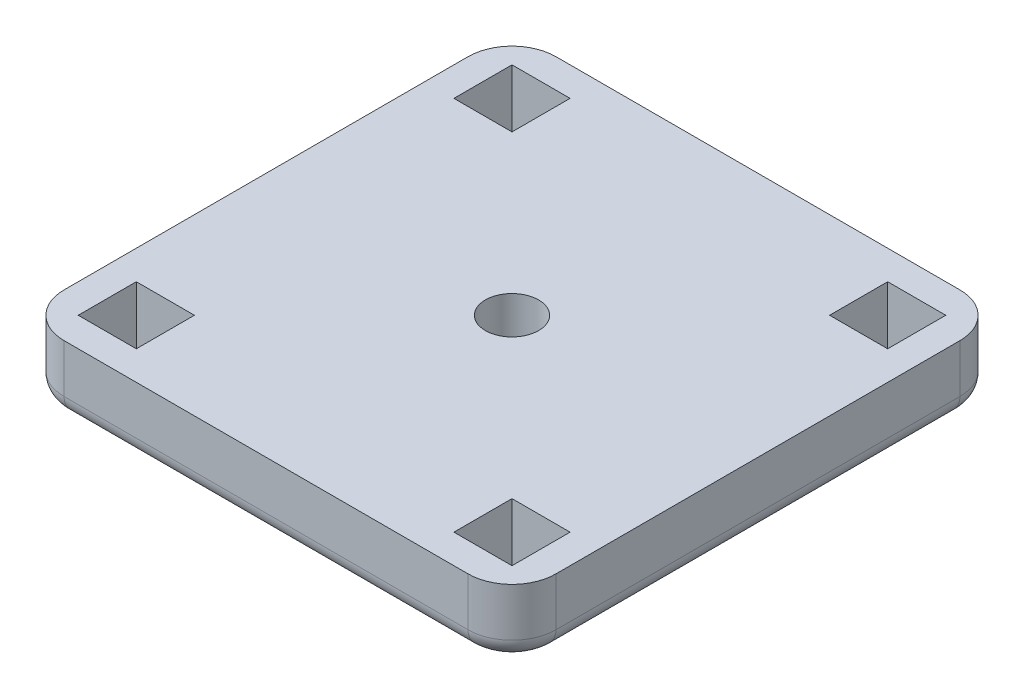
ISO-10303-21;
HEADER;
FILE_DESCRIPTION(('STEP AP214'),'2;1');
FILE_NAME('part.step','',(''),(''),'','','');
FILE_SCHEMA(('AUTOMOTIVE_DESIGN { 1 0 10303 214 1 1 1 1 }'));
ENDSEC;
DATA;
#1=APPLICATION_CONTEXT('core data for automotive mechanical design processes');
#2=APPLICATION_PROTOCOL_DEFINITION('international standard','automotive_design',2000,#1);
#3=PRODUCT_CONTEXT('',#1,'mechanical');
#4=PRODUCT('Part','Part','',(#3));
#5=PRODUCT_RELATED_PRODUCT_CATEGORY('part','',(#4));
#6=PRODUCT_DEFINITION_FORMATION('','',#4);
#7=PRODUCT_DEFINITION_CONTEXT('part definition',#1,'design');
#8=PRODUCT_DEFINITION('design','',#6,#7);
#9=PRODUCT_DEFINITION_SHAPE('','',#8);
#10=(LENGTH_UNIT() NAMED_UNIT(*) SI_UNIT(.MILLI.,.METRE.));
#11=(NAMED_UNIT(*) PLANE_ANGLE_UNIT() SI_UNIT($,.RADIAN.));
#12=(NAMED_UNIT(*) SI_UNIT($,.STERADIAN.) SOLID_ANGLE_UNIT());
#13=UNCERTAINTY_MEASURE_WITH_UNIT(LENGTH_MEASURE(1.E-05),#10,'distance_accuracy_value','');
#14=(GEOMETRIC_REPRESENTATION_CONTEXT(3) GLOBAL_UNCERTAINTY_ASSIGNED_CONTEXT((#13)) GLOBAL_UNIT_ASSIGNED_CONTEXT((#10,
#11,#12)) REPRESENTATION_CONTEXT('',''));
#15=CARTESIAN_POINT('',(0.,0.,0.));
#16=DIRECTION('',(0.,0.,1.));
#17=DIRECTION('',(1.,0.,0.));
#18=AXIS2_PLACEMENT_3D('',#15,#16,#17);
#19=CARTESIAN_POINT('',(0.,0.,0.));
#20=DIRECTION('',(0.,1.,0.));
#21=DIRECTION('',(0.,0.,1.));
#22=AXIS2_PLACEMENT_3D('',#19,#20,#21);
#23=PLANE('',#22);
#24=DIRECTION('',(-1.,0.,0.));
#25=VECTOR('',#24,1.);
#26=CARTESIAN_POINT('',(-16.4,0.,16.4));
#27=LINE('',#26,#25);
#28=CARTESIAN_POINT('',(-16.4,0.,16.4));
#29=VERTEX_POINT('',#28);
#30=CARTESIAN_POINT('',(-22.4,0.,16.4));
#31=VERTEX_POINT('',#30);
#32=EDGE_CURVE('E242',#29,#31,#27,.T.);
#33=ORIENTED_EDGE('',*,*,#32,.T.);
#34=DIRECTION('',(0.,0.,1.));
#35=VECTOR('',#34,1.);
#36=CARTESIAN_POINT('',(-22.4,0.,16.4));
#37=LINE('',#36,#35);
#38=CARTESIAN_POINT('',(-22.4,0.,22.4));
#39=VERTEX_POINT('',#38);
#40=EDGE_CURVE('E280',#31,#39,#37,.T.);
#41=ORIENTED_EDGE('',*,*,#40,.T.);
#42=DIRECTION('',(1.,0.,0.));
#43=VECTOR('',#42,1.);
#44=CARTESIAN_POINT('',(-16.4,0.,22.4));
#45=LINE('',#44,#43);
#46=CARTESIAN_POINT('',(-16.4,0.,22.4));
#47=VERTEX_POINT('',#46);
#48=EDGE_CURVE('E283',#39,#47,#45,.T.);
#49=ORIENTED_EDGE('',*,*,#48,.T.);
#50=DIRECTION('',(0.,0.,-1.));
#51=VECTOR('',#50,1.);
#52=CARTESIAN_POINT('',(-16.4,0.,16.4));
#53=LINE('',#52,#51);
#54=EDGE_CURVE('E270',#47,#29,#53,.T.);
#55=ORIENTED_EDGE('',*,*,#54,.T.);
#56=EDGE_LOOP('',(#33,#41,#49,#55));
#57=FACE_BOUND('',#56,.T.);
#58=DIRECTION('',(0.,0.,1.));
#59=VECTOR('',#58,1.);
#60=CARTESIAN_POINT('',(-22.4,0.,-16.4));
#61=LINE('',#60,#59);
#62=CARTESIAN_POINT('',(-22.4,0.,-22.4));
#63=VERTEX_POINT('',#62);
#64=CARTESIAN_POINT('',(-22.4,0.,-16.4));
#65=VERTEX_POINT('',#64);
#66=EDGE_CURVE('E328',#63,#65,#61,.T.);
#67=ORIENTED_EDGE('',*,*,#66,.T.);
#68=DIRECTION('',(1.,0.,0.));
#69=VECTOR('',#68,1.);
#70=CARTESIAN_POINT('',(-16.4,0.,-16.4));
#71=LINE('',#70,#69);
#72=CARTESIAN_POINT('',(-16.4,0.,-16.4));
#73=VERTEX_POINT('',#72);
#74=EDGE_CURVE('E342',#65,#73,#71,.T.);
#75=ORIENTED_EDGE('',*,*,#74,.T.);
#76=DIRECTION('',(0.,0.,-1.));
#77=VECTOR('',#76,1.);
#78=CARTESIAN_POINT('',(-16.4,0.,-16.4));
#79=LINE('',#78,#77);
#80=CARTESIAN_POINT('',(-16.4,0.,-22.4));
#81=VERTEX_POINT('',#80);
#82=EDGE_CURVE('E345',#73,#81,#79,.T.);
#83=ORIENTED_EDGE('',*,*,#82,.T.);
#84=DIRECTION('',(-1.,0.,0.));
#85=VECTOR('',#84,1.);
#86=CARTESIAN_POINT('',(-16.4,0.,-22.4));
#87=LINE('',#86,#85);
#88=EDGE_CURVE('E332',#81,#63,#87,.T.);
#89=ORIENTED_EDGE('',*,*,#88,.T.);
#90=EDGE_LOOP('',(#67,#75,#83,#89));
#91=FACE_BOUND('',#90,.T.);
#92=CARTESIAN_POINT('',(0.,0.,0.));
#93=DIRECTION('',(0.,1.,0.));
#94=DIRECTION('',(0.,0.,1.));
#95=AXIS2_PLACEMENT_3D('',#92,#93,#94);
#96=CIRCLE('',#95,2.75);
#97=CARTESIAN_POINT('',(0.,0.,2.75));
#98=VERTEX_POINT('',#97);
#99=EDGE_CURVE('E359',#98,#98,#96,.T.);
#100=ORIENTED_EDGE('',*,*,#99,.T.);
#101=EDGE_LOOP('',(#100));
#102=FACE_BOUND('',#101,.T.);
#103=DIRECTION('',(0.,0.,1.));
#104=VECTOR('',#103,1.);
#105=CARTESIAN_POINT('',(16.4,0.,-16.4));
#106=LINE('',#105,#104);
#107=CARTESIAN_POINT('',(16.4,0.,-22.4));
#108=VERTEX_POINT('',#107);
#109=CARTESIAN_POINT('',(16.4,0.,-16.4));
#110=VERTEX_POINT('',#109);
#111=EDGE_CURVE('E297',#108,#110,#106,.T.);
#112=ORIENTED_EDGE('',*,*,#111,.T.);
#113=DIRECTION('',(1.,0.,0.));
#114=VECTOR('',#113,1.);
#115=CARTESIAN_POINT('',(16.4,0.,-16.4));
#116=LINE('',#115,#114);
#117=CARTESIAN_POINT('',(22.4,0.,-16.4));
#118=VERTEX_POINT('',#117);
#119=EDGE_CURVE('E311',#110,#118,#116,.T.);
#120=ORIENTED_EDGE('',*,*,#119,.T.);
#121=DIRECTION('',(0.,0.,-1.));
#122=VECTOR('',#121,1.);
#123=CARTESIAN_POINT('',(22.4,0.,-16.4));
#124=LINE('',#123,#122);
#125=CARTESIAN_POINT('',(22.4,0.,-22.4));
#126=VERTEX_POINT('',#125);
#127=EDGE_CURVE('E314',#118,#126,#124,.T.);
#128=ORIENTED_EDGE('',*,*,#127,.T.);
#129=DIRECTION('',(-1.,0.,0.));
#130=VECTOR('',#129,1.);
#131=CARTESIAN_POINT('',(16.4,0.,-22.4));
#132=LINE('',#131,#130);
#133=EDGE_CURVE('E301',#126,#108,#132,.T.);
#134=ORIENTED_EDGE('',*,*,#133,.T.);
#135=EDGE_LOOP('',(#112,#120,#128,#134));
#136=FACE_BOUND('',#135,.T.);
#137=DIRECTION('',(0.,0.,1.));
#138=VECTOR('',#137,1.);
#139=CARTESIAN_POINT('',(16.4,0.,16.4));
#140=LINE('',#139,#138);
#141=CARTESIAN_POINT('',(16.4,0.,16.4));
#142=VERTEX_POINT('',#141);
#143=CARTESIAN_POINT('',(16.4,0.,22.4));
#144=VERTEX_POINT('',#143);
#145=EDGE_CURVE('E254',#142,#144,#140,.T.);
#146=ORIENTED_EDGE('',*,*,#145,.T.);
#147=DIRECTION('',(1.,0.,0.));
#148=VECTOR('',#147,1.);
#149=CARTESIAN_POINT('',(16.4,0.,22.4));
#150=LINE('',#149,#148);
#151=CARTESIAN_POINT('',(22.4,0.,22.4));
#152=VERTEX_POINT('',#151);
#153=EDGE_CURVE('E241',#144,#152,#150,.T.);
#154=ORIENTED_EDGE('',*,*,#153,.T.);
#155=DIRECTION('',(0.,0.,-1.));
#156=VECTOR('',#155,1.);
#157=CARTESIAN_POINT('',(22.4,0.,16.4));
#158=LINE('',#157,#156);
#159=CARTESIAN_POINT('',(22.4,0.,16.4));
#160=VERTEX_POINT('',#159);
#161=EDGE_CURVE('E258',#152,#160,#158,.T.);
#162=ORIENTED_EDGE('',*,*,#161,.T.);
#163=DIRECTION('',(-1.,0.,0.));
#164=VECTOR('',#163,1.);
#165=CARTESIAN_POINT('',(16.4,0.,16.4));
#166=LINE('',#165,#164);
#167=EDGE_CURVE('E235',#160,#142,#166,.T.);
#168=ORIENTED_EDGE('',*,*,#167,.T.);
#169=EDGE_LOOP('',(#146,#154,#162,#168));
#170=FACE_BOUND('',#169,.T.);
#171=CARTESIAN_POINT('',(20.86,0.,-20.86));
#172=DIRECTION('',(0.,1.,0.));
#173=DIRECTION('',(0.,0.,1.));
#174=AXIS2_PLACEMENT_3D('',#171,#172,#173);
#175=CIRCLE('',#174,2.54);
#176=CARTESIAN_POINT('',(23.4,0.,-20.86));
#177=VERTEX_POINT('',#176);
#178=CARTESIAN_POINT('',(20.86,0.,-23.4));
#179=VERTEX_POINT('',#178);
#180=EDGE_CURVE('E405',#177,#179,#175,.T.);
#181=ORIENTED_EDGE('',*,*,#180,.F.);
#182=DIRECTION('',(0.,0.,-1.));
#183=VECTOR('',#182,1.);
#184=CARTESIAN_POINT('',(23.4,0.,0.));
#185=LINE('',#184,#183);
#186=CARTESIAN_POINT('',(23.4,0.,20.86));
#187=VERTEX_POINT('',#186);
#188=EDGE_CURVE('E378',#177,#187,#185,.F.);
#189=ORIENTED_EDGE('',*,*,#188,.T.);
#190=CARTESIAN_POINT('',(20.86,0.,20.86));
#191=DIRECTION('',(0.,1.,0.));
#192=DIRECTION('',(0.,0.,1.));
#193=AXIS2_PLACEMENT_3D('',#190,#191,#192);
#194=CIRCLE('',#193,2.54);
#195=CARTESIAN_POINT('',(20.86,0.,23.4));
#196=VERTEX_POINT('',#195);
#197=EDGE_CURVE('E403',#196,#187,#194,.T.);
#198=ORIENTED_EDGE('',*,*,#197,.F.);
#199=DIRECTION('',(1.,0.,0.));
#200=VECTOR('',#199,1.);
#201=CARTESIAN_POINT('',(0.,0.,23.4));
#202=LINE('',#201,#200);
#203=CARTESIAN_POINT('',(-20.86,0.,23.4));
#204=VERTEX_POINT('',#203);
#205=EDGE_CURVE('E381',#196,#204,#202,.F.);
#206=ORIENTED_EDGE('',*,*,#205,.T.);
#207=CARTESIAN_POINT('',(-20.86,0.,20.86));
#208=DIRECTION('',(0.,1.,0.));
#209=DIRECTION('',(0.,0.,1.));
#210=AXIS2_PLACEMENT_3D('',#207,#208,#209);
#211=CIRCLE('',#210,2.54);
#212=CARTESIAN_POINT('',(-23.4,0.,20.86));
#213=VERTEX_POINT('',#212);
#214=EDGE_CURVE('E398',#213,#204,#211,.T.);
#215=ORIENTED_EDGE('',*,*,#214,.F.);
#216=DIRECTION('',(0.,0.,1.));
#217=VECTOR('',#216,1.);
#218=CARTESIAN_POINT('',(-23.4,0.,0.));
#219=LINE('',#218,#217);
#220=CARTESIAN_POINT('',(-23.4,0.,-20.86));
#221=VERTEX_POINT('',#220);
#222=EDGE_CURVE('E387',#213,#221,#219,.F.);
#223=ORIENTED_EDGE('',*,*,#222,.T.);
#224=CARTESIAN_POINT('',(-20.86,0.,-20.86));
#225=DIRECTION('',(0.,1.,0.));
#226=DIRECTION('',(0.,0.,1.));
#227=AXIS2_PLACEMENT_3D('',#224,#225,#226);
#228=CIRCLE('',#227,2.54);
#229=CARTESIAN_POINT('',(-20.86,0.,-23.4));
#230=VERTEX_POINT('',#229);
#231=EDGE_CURVE('E400',#230,#221,#228,.T.);
#232=ORIENTED_EDGE('',*,*,#231,.F.);
#233=DIRECTION('',(-1.,0.,0.));
#234=VECTOR('',#233,1.);
#235=CARTESIAN_POINT('',(0.,0.,-23.4));
#236=LINE('',#235,#234);
#237=EDGE_CURVE('E384',#230,#179,#236,.F.);
#238=ORIENTED_EDGE('',*,*,#237,.T.);
#239=EDGE_LOOP('',(#181,#189,#198,#206,#215,#223,#232,#238));
#240=FACE_BOUND('',#239,.T.);
#241=ADVANCED_FACE('F35',(#57,#91,#102,#136,#170,#240),#23,.F.);
#242=CARTESIAN_POINT('',(0.,7.,0.));
#243=DIRECTION('',(0.,1.,0.));
#244=DIRECTION('',(0.,0.,1.));
#245=AXIS2_PLACEMENT_3D('',#242,#243,#244);
#246=PLANE('',#245);
#247=DIRECTION('',(0.,0.,1.));
#248=VECTOR('',#247,1.);
#249=CARTESIAN_POINT('',(-25.4,7.,-25.4));
#250=LINE('',#249,#248);
#251=CARTESIAN_POINT('',(-25.4,7.,-20.86));
#252=VERTEX_POINT('',#251);
#253=CARTESIAN_POINT('',(-25.4,7.,20.86));
#254=VERTEX_POINT('',#253);
#255=EDGE_CURVE('E369',#252,#254,#250,.T.);
#256=ORIENTED_EDGE('',*,*,#255,.T.);
#257=CARTESIAN_POINT('',(-20.86,7.,20.86));
#258=DIRECTION('',(0.,1.,0.));
#259=DIRECTION('',(0.,0.,1.));
#260=AXIS2_PLACEMENT_3D('',#257,#258,#259);
#261=CIRCLE('',#260,4.54);
#262=CARTESIAN_POINT('',(-20.86,7.,25.4));
#263=VERTEX_POINT('',#262);
#264=EDGE_CURVE('E439',#254,#263,#261,.T.);
#265=ORIENTED_EDGE('',*,*,#264,.T.);
#266=DIRECTION('',(1.,0.,0.));
#267=VECTOR('',#266,1.);
#268=CARTESIAN_POINT('',(-25.4,7.,25.4));
#269=LINE('',#268,#267);
#270=CARTESIAN_POINT('',(20.86,7.,25.4));
#271=VERTEX_POINT('',#270);
#272=EDGE_CURVE('E372',#263,#271,#269,.T.);
#273=ORIENTED_EDGE('',*,*,#272,.T.);
#274=CARTESIAN_POINT('',(20.86,7.,20.86));
#275=DIRECTION('',(0.,1.,0.));
#276=DIRECTION('',(0.,0.,1.));
#277=AXIS2_PLACEMENT_3D('',#274,#275,#276);
#278=CIRCLE('',#277,4.54);
#279=CARTESIAN_POINT('',(25.4,7.,20.86));
#280=VERTEX_POINT('',#279);
#281=EDGE_CURVE('E435',#271,#280,#278,.T.);
#282=ORIENTED_EDGE('',*,*,#281,.T.);
#283=DIRECTION('',(0.,0.,-1.));
#284=VECTOR('',#283,1.);
#285=CARTESIAN_POINT('',(25.4,7.,-25.4));
#286=LINE('',#285,#284);
#287=CARTESIAN_POINT('',(25.4,7.,-20.86));
#288=VERTEX_POINT('',#287);
#289=EDGE_CURVE('E363',#280,#288,#286,.T.);
#290=ORIENTED_EDGE('',*,*,#289,.T.);
#291=CARTESIAN_POINT('',(20.86,7.,-20.86));
#292=DIRECTION('',(0.,1.,0.));
#293=DIRECTION('',(0.,0.,1.));
#294=AXIS2_PLACEMENT_3D('',#291,#292,#293);
#295=CIRCLE('',#294,4.54);
#296=CARTESIAN_POINT('',(20.86,7.,-25.4));
#297=VERTEX_POINT('',#296);
#298=EDGE_CURVE('E59',#288,#297,#295,.T.);
#299=ORIENTED_EDGE('',*,*,#298,.T.);
#300=DIRECTION('',(-1.,0.,0.));
#301=VECTOR('',#300,1.);
#302=CARTESIAN_POINT('',(-25.4,7.,-25.4));
#303=LINE('',#302,#301);
#304=CARTESIAN_POINT('',(-20.86,7.,-25.4));
#305=VERTEX_POINT('',#304);
#306=EDGE_CURVE('E367',#297,#305,#303,.T.);
#307=ORIENTED_EDGE('',*,*,#306,.T.);
#308=CARTESIAN_POINT('',(-20.86,7.,-20.86));
#309=DIRECTION('',(0.,1.,0.));
#310=DIRECTION('',(0.,0.,1.));
#311=AXIS2_PLACEMENT_3D('',#308,#309,#310);
#312=CIRCLE('',#311,4.54);
#313=EDGE_CURVE('E437',#305,#252,#312,.T.);
#314=ORIENTED_EDGE('',*,*,#313,.T.);
#315=EDGE_LOOP('',(#256,#265,#273,#282,#290,#299,#307,#314));
#316=FACE_BOUND('',#315,.T.);
#317=CARTESIAN_POINT('',(0.,7.,0.));
#318=DIRECTION('',(0.,1.,0.));
#319=DIRECTION('',(0.,0.,1.));
#320=AXIS2_PLACEMENT_3D('',#317,#318,#319);
#321=CIRCLE('',#320,2.75);
#322=CARTESIAN_POINT('',(0.,7.,2.75));
#323=VERTEX_POINT('',#322);
#324=EDGE_CURVE('E360',#323,#323,#321,.T.);
#325=ORIENTED_EDGE('',*,*,#324,.F.);
#326=EDGE_LOOP('',(#325));
#327=FACE_BOUND('',#326,.T.);
#328=DIRECTION('',(1.,0.,0.));
#329=VECTOR('',#328,1.);
#330=CARTESIAN_POINT('',(-16.4,7.,-16.4));
#331=LINE('',#330,#329);
#332=CARTESIAN_POINT('',(-22.4,7.,-16.4));
#333=VERTEX_POINT('',#332);
#334=CARTESIAN_POINT('',(-16.4,7.,-16.4));
#335=VERTEX_POINT('',#334);
#336=EDGE_CURVE('E331',#333,#335,#331,.T.);
#337=ORIENTED_EDGE('',*,*,#336,.F.);
#338=DIRECTION('',(0.,0.,1.));
#339=VECTOR('',#338,1.);
#340=CARTESIAN_POINT('',(-22.4,7.,-16.4));
#341=LINE('',#340,#339);
#342=CARTESIAN_POINT('',(-22.4,7.,-22.4));
#343=VERTEX_POINT('',#342);
#344=EDGE_CURVE('E329',#343,#333,#341,.T.);
#345=ORIENTED_EDGE('',*,*,#344,.F.);
#346=DIRECTION('',(-1.,0.,0.));
#347=VECTOR('',#346,1.);
#348=CARTESIAN_POINT('',(-16.4,7.,-22.4));
#349=LINE('',#348,#347);
#350=CARTESIAN_POINT('',(-16.4,7.,-22.4));
#351=VERTEX_POINT('',#350);
#352=EDGE_CURVE('E337',#351,#343,#349,.T.);
#353=ORIENTED_EDGE('',*,*,#352,.F.);
#354=DIRECTION('',(0.,0.,-1.));
#355=VECTOR('',#354,1.);
#356=CARTESIAN_POINT('',(-16.4,7.,-16.4));
#357=LINE('',#356,#355);
#358=EDGE_CURVE('E334',#335,#351,#357,.T.);
#359=ORIENTED_EDGE('',*,*,#358,.F.);
#360=EDGE_LOOP('',(#337,#345,#353,#359));
#361=FACE_BOUND('',#360,.T.);
#362=DIRECTION('',(1.,0.,0.));
#363=VECTOR('',#362,1.);
#364=CARTESIAN_POINT('',(16.4,7.,-16.4));
#365=LINE('',#364,#363);
#366=CARTESIAN_POINT('',(16.4,7.,-16.4));
#367=VERTEX_POINT('',#366);
#368=CARTESIAN_POINT('',(22.4,7.,-16.4));
#369=VERTEX_POINT('',#368);
#370=EDGE_CURVE('E300',#367,#369,#365,.T.);
#371=ORIENTED_EDGE('',*,*,#370,.F.);
#372=DIRECTION('',(0.,0.,1.));
#373=VECTOR('',#372,1.);
#374=CARTESIAN_POINT('',(16.4,7.,-16.4));
#375=LINE('',#374,#373);
#376=CARTESIAN_POINT('',(16.4,7.,-22.4));
#377=VERTEX_POINT('',#376);
#378=EDGE_CURVE('E298',#377,#367,#375,.T.);
#379=ORIENTED_EDGE('',*,*,#378,.F.);
#380=DIRECTION('',(-1.,0.,0.));
#381=VECTOR('',#380,1.);
#382=CARTESIAN_POINT('',(16.4,7.,-22.4));
#383=LINE('',#382,#381);
#384=CARTESIAN_POINT('',(22.4,7.,-22.4));
#385=VERTEX_POINT('',#384);
#386=EDGE_CURVE('E306',#385,#377,#383,.T.);
#387=ORIENTED_EDGE('',*,*,#386,.F.);
#388=DIRECTION('',(0.,0.,-1.));
#389=VECTOR('',#388,1.);
#390=CARTESIAN_POINT('',(22.4,7.,-16.4));
#391=LINE('',#390,#389);
#392=EDGE_CURVE('E303',#369,#385,#391,.T.);
#393=ORIENTED_EDGE('',*,*,#392,.F.);
#394=EDGE_LOOP('',(#371,#379,#387,#393));
#395=FACE_BOUND('',#394,.T.);
#396=DIRECTION('',(0.,0.,1.));
#397=VECTOR('',#396,1.);
#398=CARTESIAN_POINT('',(-22.4,7.,16.4));
#399=LINE('',#398,#397);
#400=CARTESIAN_POINT('',(-22.4,7.,16.4));
#401=VERTEX_POINT('',#400);
#402=CARTESIAN_POINT('',(-22.4,7.,22.4));
#403=VERTEX_POINT('',#402);
#404=EDGE_CURVE('E269',#401,#403,#399,.T.);
#405=ORIENTED_EDGE('',*,*,#404,.F.);
#406=DIRECTION('',(-1.,0.,0.));
#407=VECTOR('',#406,1.);
#408=CARTESIAN_POINT('',(-16.4,7.,16.4));
#409=LINE('',#408,#407);
#410=CARTESIAN_POINT('',(-16.4,7.,16.4));
#411=VERTEX_POINT('',#410);
#412=EDGE_CURVE('E267',#411,#401,#409,.T.);
#413=ORIENTED_EDGE('',*,*,#412,.F.);
#414=DIRECTION('',(0.,0.,-1.));
#415=VECTOR('',#414,1.);
#416=CARTESIAN_POINT('',(-16.4,7.,16.4));
#417=LINE('',#416,#415);
#418=CARTESIAN_POINT('',(-16.4,7.,22.4));
#419=VERTEX_POINT('',#418);
#420=EDGE_CURVE('E275',#419,#411,#417,.T.);
#421=ORIENTED_EDGE('',*,*,#420,.F.);
#422=DIRECTION('',(1.,0.,0.));
#423=VECTOR('',#422,1.);
#424=CARTESIAN_POINT('',(-16.4,7.,22.4));
#425=LINE('',#424,#423);
#426=EDGE_CURVE('E272',#403,#419,#425,.T.);
#427=ORIENTED_EDGE('',*,*,#426,.F.);
#428=EDGE_LOOP('',(#405,#413,#421,#427));
#429=FACE_BOUND('',#428,.T.);
#430=DIRECTION('',(1.,0.,0.));
#431=VECTOR('',#430,1.);
#432=CARTESIAN_POINT('',(16.4,7.,22.4));
#433=LINE('',#432,#431);
#434=CARTESIAN_POINT('',(16.4,7.,22.4));
#435=VERTEX_POINT('',#434);
#436=CARTESIAN_POINT('',(22.4,7.,22.4));
#437=VERTEX_POINT('',#436);
#438=EDGE_CURVE('E234',#435,#437,#433,.T.);
#439=ORIENTED_EDGE('',*,*,#438,.F.);
#440=DIRECTION('',(0.,0.,1.));
#441=VECTOR('',#440,1.);
#442=CARTESIAN_POINT('',(16.4,7.,16.4));
#443=LINE('',#442,#441);
#444=CARTESIAN_POINT('',(16.4,7.,16.4));
#445=VERTEX_POINT('',#444);
#446=EDGE_CURVE('E224',#445,#435,#443,.T.);
#447=ORIENTED_EDGE('',*,*,#446,.F.);
#448=DIRECTION('',(-1.,0.,0.));
#449=VECTOR('',#448,1.);
#450=CARTESIAN_POINT('',(16.4,7.,16.4));
#451=LINE('',#450,#449);
#452=CARTESIAN_POINT('',(22.4,7.,16.4));
#453=VERTEX_POINT('',#452);
#454=EDGE_CURVE('E250',#453,#445,#451,.T.);
#455=ORIENTED_EDGE('',*,*,#454,.F.);
#456=DIRECTION('',(0.,0.,-1.));
#457=VECTOR('',#456,1.);
#458=CARTESIAN_POINT('',(22.4,7.,16.4));
#459=LINE('',#458,#457);
#460=EDGE_CURVE('E248',#437,#453,#459,.T.);
#461=ORIENTED_EDGE('',*,*,#460,.F.);
#462=EDGE_LOOP('',(#439,#447,#455,#461));
#463=FACE_BOUND('',#462,.T.);
#464=ADVANCED_FACE('F246',(#316,#327,#361,#395,#429,#463),#246,.T.);
#465=CARTESIAN_POINT('',(25.4,7.,-25.4));
#466=DIRECTION('',(-1.,0.,0.));
#467=DIRECTION('',(0.,0.,1.));
#468=AXIS2_PLACEMENT_3D('',#465,#466,#467);
#469=PLANE('',#468);
#470=ORIENTED_EDGE('',*,*,#289,.F.);
#471=DIRECTION('',(0.,-1.,0.));
#472=VECTOR('',#471,1.);
#473=CARTESIAN_POINT('',(25.4,7.,20.86));
#474=LINE('',#473,#472);
#475=CARTESIAN_POINT('',(25.4,2.,20.86));
#476=VERTEX_POINT('',#475);
#477=EDGE_CURVE('E11',#280,#476,#474,.T.);
#478=ORIENTED_EDGE('',*,*,#477,.T.);
#479=DIRECTION('',(0.,0.,-1.));
#480=VECTOR('',#479,1.);
#481=CARTESIAN_POINT('',(25.4,2.,-25.4));
#482=LINE('',#481,#480);
#483=CARTESIAN_POINT('',(25.4,2.,-20.86));
#484=VERTEX_POINT('',#483);
#485=EDGE_CURVE('E395',#476,#484,#482,.T.);
#486=ORIENTED_EDGE('',*,*,#485,.T.);
#487=DIRECTION('',(0.,-1.,0.));
#488=VECTOR('',#487,1.);
#489=CARTESIAN_POINT('',(25.4,7.,-20.86));
#490=LINE('',#489,#488);
#491=EDGE_CURVE('E44',#484,#288,#490,.F.);
#492=ORIENTED_EDGE('',*,*,#491,.T.);
#493=EDGE_LOOP('',(#470,#478,#486,#492));
#494=FACE_BOUND('',#493,.T.);
#495=ADVANCED_FACE('F516',(#494),#469,.F.);
#496=CARTESIAN_POINT('',(-25.4,7.,-25.4));
#497=DIRECTION('',(0.,0.,1.));
#498=DIRECTION('',(1.,0.,0.));
#499=AXIS2_PLACEMENT_3D('',#496,#497,#498);
#500=PLANE('',#499);
#501=DIRECTION('',(-1.,0.,0.));
#502=VECTOR('',#501,1.);
#503=CARTESIAN_POINT('',(-25.4,2.,-25.4));
#504=LINE('',#503,#502);
#505=CARTESIAN_POINT('',(20.86,2.,-25.4));
#506=VERTEX_POINT('',#505);
#507=CARTESIAN_POINT('',(-20.86,2.,-25.4));
#508=VERTEX_POINT('',#507);
#509=EDGE_CURVE('E390',#506,#508,#504,.T.);
#510=ORIENTED_EDGE('',*,*,#509,.T.);
#511=DIRECTION('',(0.,-1.,0.));
#512=VECTOR('',#511,1.);
#513=CARTESIAN_POINT('',(-20.86,7.,-25.4));
#514=LINE('',#513,#512);
#515=EDGE_CURVE('E52',#508,#305,#514,.F.);
#516=ORIENTED_EDGE('',*,*,#515,.T.);
#517=ORIENTED_EDGE('',*,*,#306,.F.);
#518=DIRECTION('',(0.,-1.,0.));
#519=VECTOR('',#518,1.);
#520=CARTESIAN_POINT('',(20.86,7.,-25.4));
#521=LINE('',#520,#519);
#522=EDGE_CURVE('E441',#297,#506,#521,.T.);
#523=ORIENTED_EDGE('',*,*,#522,.T.);
#524=EDGE_LOOP('',(#510,#516,#517,#523));
#525=FACE_BOUND('',#524,.T.);
#526=ADVANCED_FACE('F486',(#525),#500,.F.);
#527=CARTESIAN_POINT('',(-25.4,7.,-25.4));
#528=DIRECTION('',(1.,0.,0.));
#529=DIRECTION('',(0.,0.,-1.));
#530=AXIS2_PLACEMENT_3D('',#527,#528,#529);
#531=PLANE('',#530);
#532=DIRECTION('',(0.,0.,1.));
#533=VECTOR('',#532,1.);
#534=CARTESIAN_POINT('',(-25.4,2.,-25.4));
#535=LINE('',#534,#533);
#536=CARTESIAN_POINT('',(-25.4,2.,-20.86));
#537=VERTEX_POINT('',#536);
#538=CARTESIAN_POINT('',(-25.4,2.,20.86));
#539=VERTEX_POINT('',#538);
#540=EDGE_CURVE('E375',#537,#539,#535,.T.);
#541=ORIENTED_EDGE('',*,*,#540,.T.);
#542=DIRECTION('',(0.,-1.,0.));
#543=VECTOR('',#542,1.);
#544=CARTESIAN_POINT('',(-25.4,7.,20.86));
#545=LINE('',#544,#543);
#546=EDGE_CURVE('E432',#539,#254,#545,.F.);
#547=ORIENTED_EDGE('',*,*,#546,.T.);
#548=ORIENTED_EDGE('',*,*,#255,.F.);
#549=DIRECTION('',(0.,-1.,0.));
#550=VECTOR('',#549,1.);
#551=CARTESIAN_POINT('',(-25.4,7.,-20.86));
#552=LINE('',#551,#550);
#553=EDGE_CURVE('E430',#252,#537,#552,.T.);
#554=ORIENTED_EDGE('',*,*,#553,.T.);
#555=EDGE_LOOP('',(#541,#547,#548,#554));
#556=FACE_BOUND('',#555,.T.);
#557=ADVANCED_FACE('F466',(#556),#531,.F.);
#558=CARTESIAN_POINT('',(-25.4,7.,25.4));
#559=DIRECTION('',(0.,0.,-1.));
#560=DIRECTION('',(-1.,0.,0.));
#561=AXIS2_PLACEMENT_3D('',#558,#559,#560);
#562=PLANE('',#561);
#563=ORIENTED_EDGE('',*,*,#272,.F.);
#564=DIRECTION('',(0.,-1.,0.));
#565=VECTOR('',#564,1.);
#566=CARTESIAN_POINT('',(-20.86,7.,25.4));
#567=LINE('',#566,#565);
#568=CARTESIAN_POINT('',(-20.86,2.,25.4));
#569=VERTEX_POINT('',#568);
#570=EDGE_CURVE('E428',#263,#569,#567,.T.);
#571=ORIENTED_EDGE('',*,*,#570,.T.);
#572=DIRECTION('',(1.,0.,0.));
#573=VECTOR('',#572,1.);
#574=CARTESIAN_POINT('',(-25.4,2.,25.4));
#575=LINE('',#574,#573);
#576=CARTESIAN_POINT('',(20.86,2.,25.4));
#577=VERTEX_POINT('',#576);
#578=EDGE_CURVE('E392',#569,#577,#575,.T.);
#579=ORIENTED_EDGE('',*,*,#578,.T.);
#580=DIRECTION('',(0.,-1.,0.));
#581=VECTOR('',#580,1.);
#582=CARTESIAN_POINT('',(20.86,7.,25.4));
#583=LINE('',#582,#581);
#584=EDGE_CURVE('E426',#577,#271,#583,.F.);
#585=ORIENTED_EDGE('',*,*,#584,.T.);
#586=EDGE_LOOP('',(#563,#571,#579,#585));
#587=FACE_BOUND('',#586,.T.);
#588=ADVANCED_FACE('F509',(#587),#562,.F.);
#589=CARTESIAN_POINT('',(0.,7.,0.));
#590=DIRECTION('',(0.,-1.,0.));
#591=DIRECTION('',(0.,0.,-1.));
#592=AXIS2_PLACEMENT_3D('',#589,#590,#591);
#593=CYLINDRICAL_SURFACE('',#592,2.75);
#594=ORIENTED_EDGE('',*,*,#324,.T.);
#595=EDGE_LOOP('',(#594));
#596=FACE_BOUND('',#595,.T.);
#597=ORIENTED_EDGE('',*,*,#99,.F.);
#598=EDGE_LOOP('',(#597));
#599=FACE_BOUND('',#598,.T.);
#600=ADVANCED_FACE('F536',(#596,#599),#593,.F.);
#601=CARTESIAN_POINT('',(-22.4,7.,-16.4));
#602=DIRECTION('',(1.,0.,0.));
#603=DIRECTION('',(0.,0.,-1.));
#604=AXIS2_PLACEMENT_3D('',#601,#602,#603);
#605=PLANE('',#604);
#606=ORIENTED_EDGE('',*,*,#66,.F.);
#607=DIRECTION('',(0.,-1.,0.));
#608=VECTOR('',#607,1.);
#609=CARTESIAN_POINT('',(-22.4,7.,-22.4));
#610=LINE('',#609,#608);
#611=EDGE_CURVE('E339',#343,#63,#610,.T.);
#612=ORIENTED_EDGE('',*,*,#611,.F.);
#613=ORIENTED_EDGE('',*,*,#344,.T.);
#614=DIRECTION('',(0.,-1.,0.));
#615=VECTOR('',#614,1.);
#616=CARTESIAN_POINT('',(-22.4,7.,-16.4));
#617=LINE('',#616,#615);
#618=EDGE_CURVE('E356',#333,#65,#617,.T.);
#619=ORIENTED_EDGE('',*,*,#618,.T.);
#620=EDGE_LOOP('',(#606,#612,#613,#619));
#621=FACE_BOUND('',#620,.T.);
#622=ADVANCED_FACE('F553',(#621),#605,.T.);
#623=CARTESIAN_POINT('',(-16.4,7.,-16.4));
#624=DIRECTION('',(0.,0.,-1.));
#625=DIRECTION('',(-1.,0.,0.));
#626=AXIS2_PLACEMENT_3D('',#623,#624,#625);
#627=PLANE('',#626);
#628=ORIENTED_EDGE('',*,*,#74,.F.);
#629=ORIENTED_EDGE('',*,*,#618,.F.);
#630=ORIENTED_EDGE('',*,*,#336,.T.);
#631=DIRECTION('',(0.,-1.,0.));
#632=VECTOR('',#631,1.);
#633=CARTESIAN_POINT('',(-16.4,7.,-16.4));
#634=LINE('',#633,#632);
#635=EDGE_CURVE('E354',#335,#73,#634,.T.);
#636=ORIENTED_EDGE('',*,*,#635,.T.);
#637=EDGE_LOOP('',(#628,#629,#630,#636));
#638=FACE_BOUND('',#637,.T.);
#639=ADVANCED_FACE('F560',(#638),#627,.T.);
#640=CARTESIAN_POINT('',(-16.4,7.,-16.4));
#641=DIRECTION('',(-1.,0.,0.));
#642=DIRECTION('',(0.,0.,1.));
#643=AXIS2_PLACEMENT_3D('',#640,#641,#642);
#644=PLANE('',#643);
#645=ORIENTED_EDGE('',*,*,#82,.F.);
#646=ORIENTED_EDGE('',*,*,#635,.F.);
#647=ORIENTED_EDGE('',*,*,#358,.T.);
#648=DIRECTION('',(0.,-1.,0.));
#649=VECTOR('',#648,1.);
#650=CARTESIAN_POINT('',(-16.4,7.,-22.4));
#651=LINE('',#650,#649);
#652=EDGE_CURVE('E352',#351,#81,#651,.T.);
#653=ORIENTED_EDGE('',*,*,#652,.T.);
#654=EDGE_LOOP('',(#645,#646,#647,#653));
#655=FACE_BOUND('',#654,.T.);
#656=ADVANCED_FACE('F568',(#655),#644,.T.);
#657=CARTESIAN_POINT('',(-16.4,7.,-22.4));
#658=DIRECTION('',(0.,0.,1.));
#659=DIRECTION('',(1.,0.,0.));
#660=AXIS2_PLACEMENT_3D('',#657,#658,#659);
#661=PLANE('',#660);
#662=ORIENTED_EDGE('',*,*,#88,.F.);
#663=ORIENTED_EDGE('',*,*,#652,.F.);
#664=ORIENTED_EDGE('',*,*,#352,.T.);
#665=ORIENTED_EDGE('',*,*,#611,.T.);
#666=EDGE_LOOP('',(#662,#663,#664,#665));
#667=FACE_BOUND('',#666,.T.);
#668=ADVANCED_FACE('F576',(#667),#661,.T.);
#669=CARTESIAN_POINT('',(16.4,7.,-16.4));
#670=DIRECTION('',(1.,0.,0.));
#671=DIRECTION('',(0.,0.,-1.));
#672=AXIS2_PLACEMENT_3D('',#669,#670,#671);
#673=PLANE('',#672);
#674=ORIENTED_EDGE('',*,*,#111,.F.);
#675=DIRECTION('',(0.,-1.,0.));
#676=VECTOR('',#675,1.);
#677=CARTESIAN_POINT('',(16.4,7.,-22.4));
#678=LINE('',#677,#676);
#679=EDGE_CURVE('E308',#377,#108,#678,.T.);
#680=ORIENTED_EDGE('',*,*,#679,.F.);
#681=ORIENTED_EDGE('',*,*,#378,.T.);
#682=DIRECTION('',(0.,-1.,0.));
#683=VECTOR('',#682,1.);
#684=CARTESIAN_POINT('',(16.4,7.,-16.4));
#685=LINE('',#684,#683);
#686=EDGE_CURVE('E325',#367,#110,#685,.T.);
#687=ORIENTED_EDGE('',*,*,#686,.T.);
#688=EDGE_LOOP('',(#674,#680,#681,#687));
#689=FACE_BOUND('',#688,.T.);
#690=ADVANCED_FACE('F584',(#689),#673,.T.);
#691=CARTESIAN_POINT('',(16.4,7.,-16.4));
#692=DIRECTION('',(0.,0.,-1.));
#693=DIRECTION('',(-1.,0.,0.));
#694=AXIS2_PLACEMENT_3D('',#691,#692,#693);
#695=PLANE('',#694);
#696=ORIENTED_EDGE('',*,*,#119,.F.);
#697=ORIENTED_EDGE('',*,*,#686,.F.);
#698=ORIENTED_EDGE('',*,*,#370,.T.);
#699=DIRECTION('',(0.,-1.,0.));
#700=VECTOR('',#699,1.);
#701=CARTESIAN_POINT('',(22.4,7.,-16.4));
#702=LINE('',#701,#700);
#703=EDGE_CURVE('E323',#369,#118,#702,.T.);
#704=ORIENTED_EDGE('',*,*,#703,.T.);
#705=EDGE_LOOP('',(#696,#697,#698,#704));
#706=FACE_BOUND('',#705,.T.);
#707=ADVANCED_FACE('F592',(#706),#695,.T.);
#708=CARTESIAN_POINT('',(22.4,7.,-16.4));
#709=DIRECTION('',(-1.,0.,0.));
#710=DIRECTION('',(0.,0.,1.));
#711=AXIS2_PLACEMENT_3D('',#708,#709,#710);
#712=PLANE('',#711);
#713=ORIENTED_EDGE('',*,*,#127,.F.);
#714=ORIENTED_EDGE('',*,*,#703,.F.);
#715=ORIENTED_EDGE('',*,*,#392,.T.);
#716=DIRECTION('',(0.,-1.,0.));
#717=VECTOR('',#716,1.);
#718=CARTESIAN_POINT('',(22.4,7.,-22.4));
#719=LINE('',#718,#717);
#720=EDGE_CURVE('E321',#385,#126,#719,.T.);
#721=ORIENTED_EDGE('',*,*,#720,.T.);
#722=EDGE_LOOP('',(#713,#714,#715,#721));
#723=FACE_BOUND('',#722,.T.);
#724=ADVANCED_FACE('F600',(#723),#712,.T.);
#725=CARTESIAN_POINT('',(16.4,7.,-22.4));
#726=DIRECTION('',(0.,0.,1.));
#727=DIRECTION('',(1.,0.,0.));
#728=AXIS2_PLACEMENT_3D('',#725,#726,#727);
#729=PLANE('',#728);
#730=ORIENTED_EDGE('',*,*,#133,.F.);
#731=ORIENTED_EDGE('',*,*,#720,.F.);
#732=ORIENTED_EDGE('',*,*,#386,.T.);
#733=ORIENTED_EDGE('',*,*,#679,.T.);
#734=EDGE_LOOP('',(#730,#731,#732,#733));
#735=FACE_BOUND('',#734,.T.);
#736=ADVANCED_FACE('F608',(#735),#729,.T.);
#737=CARTESIAN_POINT('',(-16.4,7.,16.4));
#738=DIRECTION('',(0.,0.,1.));
#739=DIRECTION('',(1.,0.,0.));
#740=AXIS2_PLACEMENT_3D('',#737,#738,#739);
#741=PLANE('',#740);
#742=ORIENTED_EDGE('',*,*,#32,.F.);
#743=DIRECTION('',(0.,-1.,0.));
#744=VECTOR('',#743,1.);
#745=CARTESIAN_POINT('',(-16.4,7.,16.4));
#746=LINE('',#745,#744);
#747=EDGE_CURVE('E277',#411,#29,#746,.T.);
#748=ORIENTED_EDGE('',*,*,#747,.F.);
#749=ORIENTED_EDGE('',*,*,#412,.T.);
#750=DIRECTION('',(0.,-1.,0.));
#751=VECTOR('',#750,1.);
#752=CARTESIAN_POINT('',(-22.4,7.,16.4));
#753=LINE('',#752,#751);
#754=EDGE_CURVE('E294',#401,#31,#753,.T.);
#755=ORIENTED_EDGE('',*,*,#754,.T.);
#756=EDGE_LOOP('',(#742,#748,#749,#755));
#757=FACE_BOUND('',#756,.T.);
#758=ADVANCED_FACE('F616',(#757),#741,.T.);
#759=CARTESIAN_POINT('',(-22.4,7.,16.4));
#760=DIRECTION('',(1.,0.,0.));
#761=DIRECTION('',(0.,0.,-1.));
#762=AXIS2_PLACEMENT_3D('',#759,#760,#761);
#763=PLANE('',#762);
#764=ORIENTED_EDGE('',*,*,#40,.F.);
#765=ORIENTED_EDGE('',*,*,#754,.F.);
#766=ORIENTED_EDGE('',*,*,#404,.T.);
#767=DIRECTION('',(0.,-1.,0.));
#768=VECTOR('',#767,1.);
#769=CARTESIAN_POINT('',(-22.4,7.,22.4));
#770=LINE('',#769,#768);
#771=EDGE_CURVE('E292',#403,#39,#770,.T.);
#772=ORIENTED_EDGE('',*,*,#771,.T.);
#773=EDGE_LOOP('',(#764,#765,#766,#772));
#774=FACE_BOUND('',#773,.T.);
#775=ADVANCED_FACE('F624',(#774),#763,.T.);
#776=CARTESIAN_POINT('',(-16.4,7.,22.4));
#777=DIRECTION('',(0.,0.,-1.));
#778=DIRECTION('',(-1.,0.,0.));
#779=AXIS2_PLACEMENT_3D('',#776,#777,#778);
#780=PLANE('',#779);
#781=ORIENTED_EDGE('',*,*,#48,.F.);
#782=ORIENTED_EDGE('',*,*,#771,.F.);
#783=ORIENTED_EDGE('',*,*,#426,.T.);
#784=DIRECTION('',(0.,-1.,0.));
#785=VECTOR('',#784,1.);
#786=CARTESIAN_POINT('',(-16.4,7.,22.4));
#787=LINE('',#786,#785);
#788=EDGE_CURVE('E290',#419,#47,#787,.T.);
#789=ORIENTED_EDGE('',*,*,#788,.T.);
#790=EDGE_LOOP('',(#781,#782,#783,#789));
#791=FACE_BOUND('',#790,.T.);
#792=ADVANCED_FACE('F632',(#791),#780,.T.);
#793=CARTESIAN_POINT('',(-16.4,7.,16.4));
#794=DIRECTION('',(-1.,0.,0.));
#795=DIRECTION('',(0.,0.,1.));
#796=AXIS2_PLACEMENT_3D('',#793,#794,#795);
#797=PLANE('',#796);
#798=ORIENTED_EDGE('',*,*,#54,.F.);
#799=ORIENTED_EDGE('',*,*,#788,.F.);
#800=ORIENTED_EDGE('',*,*,#420,.T.);
#801=ORIENTED_EDGE('',*,*,#747,.T.);
#802=EDGE_LOOP('',(#798,#799,#800,#801));
#803=FACE_BOUND('',#802,.T.);
#804=ADVANCED_FACE('F640',(#803),#797,.T.);
#805=CARTESIAN_POINT('',(16.4,7.,16.4));
#806=DIRECTION('',(1.,0.,0.));
#807=DIRECTION('',(0.,0.,-1.));
#808=AXIS2_PLACEMENT_3D('',#805,#806,#807);
#809=PLANE('',#808);
#810=ORIENTED_EDGE('',*,*,#145,.F.);
#811=DIRECTION('',(0.,-1.,0.));
#812=VECTOR('',#811,1.);
#813=CARTESIAN_POINT('',(16.4,7.,16.4));
#814=LINE('',#813,#812);
#815=EDGE_CURVE('E230',#445,#142,#814,.T.);
#816=ORIENTED_EDGE('',*,*,#815,.F.);
#817=ORIENTED_EDGE('',*,*,#446,.T.);
#818=DIRECTION('',(0.,-1.,0.));
#819=VECTOR('',#818,1.);
#820=CARTESIAN_POINT('',(16.4,7.,22.4));
#821=LINE('',#820,#819);
#822=EDGE_CURVE('E227',#435,#144,#821,.T.);
#823=ORIENTED_EDGE('',*,*,#822,.T.);
#824=EDGE_LOOP('',(#810,#816,#817,#823));
#825=FACE_BOUND('',#824,.T.);
#826=ADVANCED_FACE('F226',(#825),#809,.T.);
#827=CARTESIAN_POINT('',(16.4,7.,22.4));
#828=DIRECTION('',(0.,0.,-1.));
#829=DIRECTION('',(-1.,0.,0.));
#830=AXIS2_PLACEMENT_3D('',#827,#828,#829);
#831=PLANE('',#830);
#832=ORIENTED_EDGE('',*,*,#153,.F.);
#833=ORIENTED_EDGE('',*,*,#822,.F.);
#834=ORIENTED_EDGE('',*,*,#438,.T.);
#835=DIRECTION('',(0.,-1.,0.));
#836=VECTOR('',#835,1.);
#837=CARTESIAN_POINT('',(22.4,7.,22.4));
#838=LINE('',#837,#836);
#839=EDGE_CURVE('E243',#437,#152,#838,.T.);
#840=ORIENTED_EDGE('',*,*,#839,.T.);
#841=EDGE_LOOP('',(#832,#833,#834,#840));
#842=FACE_BOUND('',#841,.T.);
#843=ADVANCED_FACE('F238',(#842),#831,.T.);
#844=CARTESIAN_POINT('',(22.4,7.,16.4));
#845=DIRECTION('',(-1.,0.,0.));
#846=DIRECTION('',(0.,0.,1.));
#847=AXIS2_PLACEMENT_3D('',#844,#845,#846);
#848=PLANE('',#847);
#849=ORIENTED_EDGE('',*,*,#161,.F.);
#850=ORIENTED_EDGE('',*,*,#839,.F.);
#851=ORIENTED_EDGE('',*,*,#460,.T.);
#852=DIRECTION('',(0.,-1.,0.));
#853=VECTOR('',#852,1.);
#854=CARTESIAN_POINT('',(22.4,7.,16.4));
#855=LINE('',#854,#853);
#856=EDGE_CURVE('E264',#453,#160,#855,.T.);
#857=ORIENTED_EDGE('',*,*,#856,.T.);
#858=EDGE_LOOP('',(#849,#850,#851,#857));
#859=FACE_BOUND('',#858,.T.);
#860=ADVANCED_FACE('F661',(#859),#848,.T.);
#861=CARTESIAN_POINT('',(16.4,7.,16.4));
#862=DIRECTION('',(0.,0.,1.));
#863=DIRECTION('',(1.,0.,0.));
#864=AXIS2_PLACEMENT_3D('',#861,#862,#863);
#865=PLANE('',#864);
#866=ORIENTED_EDGE('',*,*,#167,.F.);
#867=ORIENTED_EDGE('',*,*,#856,.F.);
#868=ORIENTED_EDGE('',*,*,#454,.T.);
#869=ORIENTED_EDGE('',*,*,#815,.T.);
#870=EDGE_LOOP('',(#866,#867,#868,#869));
#871=FACE_BOUND('',#870,.T.);
#872=ADVANCED_FACE('F668',(#871),#865,.T.);
#873=CARTESIAN_POINT('',(23.4,2.,-25.4));
#874=DIRECTION('',(0.,0.,-1.));
#875=DIRECTION('',(-1.,0.,0.));
#876=AXIS2_PLACEMENT_3D('',#873,#874,#875);
#877=CYLINDRICAL_SURFACE('',#876,2.);
#878=ORIENTED_EDGE('',*,*,#485,.F.);
#879=CARTESIAN_POINT('',(23.4,2.,20.86));
#880=DIRECTION('',(0.,0.,-1.));
#881=DIRECTION('',(-1.,0.,0.));
#882=AXIS2_PLACEMENT_3D('',#879,#880,#881);
#883=CIRCLE('',#882,2.);
#884=EDGE_CURVE('E414',#476,#187,#883,.T.);
#885=ORIENTED_EDGE('',*,*,#884,.T.);
#886=ORIENTED_EDGE('',*,*,#188,.F.);
#887=CARTESIAN_POINT('',(23.4,2.,-20.86));
#888=DIRECTION('',(0.,0.,1.));
#889=DIRECTION('',(1.,0.,0.));
#890=AXIS2_PLACEMENT_3D('',#887,#888,#889);
#891=CIRCLE('',#890,2.);
#892=EDGE_CURVE('E412',#177,#484,#891,.T.);
#893=ORIENTED_EDGE('',*,*,#892,.T.);
#894=EDGE_LOOP('',(#878,#885,#886,#893));
#895=FACE_BOUND('',#894,.T.);
#896=ADVANCED_FACE('F497',(#895),#877,.T.);
#897=CARTESIAN_POINT('',(-25.4,2.,-23.4));
#898=DIRECTION('',(-1.,0.,0.));
#899=DIRECTION('',(0.,0.,1.));
#900=AXIS2_PLACEMENT_3D('',#897,#898,#899);
#901=CYLINDRICAL_SURFACE('',#900,2.);
#902=ORIENTED_EDGE('',*,*,#509,.F.);
#903=CARTESIAN_POINT('',(20.86,2.,-23.4));
#904=DIRECTION('',(-1.,0.,0.));
#905=DIRECTION('',(0.,0.,1.));
#906=AXIS2_PLACEMENT_3D('',#903,#904,#905);
#907=CIRCLE('',#906,2.);
#908=EDGE_CURVE('E410',#506,#179,#907,.T.);
#909=ORIENTED_EDGE('',*,*,#908,.T.);
#910=ORIENTED_EDGE('',*,*,#237,.F.);
#911=CARTESIAN_POINT('',(-20.86,2.,-23.4));
#912=DIRECTION('',(1.,0.,0.));
#913=DIRECTION('',(0.,0.,-1.));
#914=AXIS2_PLACEMENT_3D('',#911,#912,#913);
#915=CIRCLE('',#914,2.);
#916=EDGE_CURVE('E408',#230,#508,#915,.T.);
#917=ORIENTED_EDGE('',*,*,#916,.T.);
#918=EDGE_LOOP('',(#902,#909,#910,#917));
#919=FACE_BOUND('',#918,.T.);
#920=ADVANCED_FACE('F484',(#919),#901,.T.);
#921=CARTESIAN_POINT('',(-25.4,2.,23.4));
#922=DIRECTION('',(1.,0.,0.));
#923=DIRECTION('',(0.,0.,-1.));
#924=AXIS2_PLACEMENT_3D('',#921,#922,#923);
#925=CYLINDRICAL_SURFACE('',#924,2.);
#926=ORIENTED_EDGE('',*,*,#578,.F.);
#927=CARTESIAN_POINT('',(-20.86,2.,23.4));
#928=DIRECTION('',(1.,0.,0.));
#929=DIRECTION('',(0.,0.,-1.));
#930=AXIS2_PLACEMENT_3D('',#927,#928,#929);
#931=CIRCLE('',#930,2.);
#932=EDGE_CURVE('E423',#569,#204,#931,.T.);
#933=ORIENTED_EDGE('',*,*,#932,.T.);
#934=ORIENTED_EDGE('',*,*,#205,.F.);
#935=CARTESIAN_POINT('',(20.86,2.,23.4));
#936=DIRECTION('',(-1.,0.,0.));
#937=DIRECTION('',(0.,0.,1.));
#938=AXIS2_PLACEMENT_3D('',#935,#936,#937);
#939=CIRCLE('',#938,2.);
#940=EDGE_CURVE('E421',#196,#577,#939,.T.);
#941=ORIENTED_EDGE('',*,*,#940,.T.);
#942=EDGE_LOOP('',(#926,#933,#934,#941));
#943=FACE_BOUND('',#942,.T.);
#944=ADVANCED_FACE('F506',(#943),#925,.T.);
#945=CARTESIAN_POINT('',(-23.4,2.,-25.4));
#946=DIRECTION('',(0.,0.,1.));
#947=DIRECTION('',(1.,0.,0.));
#948=AXIS2_PLACEMENT_3D('',#945,#946,#947);
#949=CYLINDRICAL_SURFACE('',#948,2.);
#950=ORIENTED_EDGE('',*,*,#540,.F.);
#951=CARTESIAN_POINT('',(-23.4,2.,-20.86));
#952=DIRECTION('',(0.,0.,1.));
#953=DIRECTION('',(1.,0.,0.));
#954=AXIS2_PLACEMENT_3D('',#951,#952,#953);
#955=CIRCLE('',#954,2.);
#956=EDGE_CURVE('E419',#537,#221,#955,.T.);
#957=ORIENTED_EDGE('',*,*,#956,.T.);
#958=ORIENTED_EDGE('',*,*,#222,.F.);
#959=CARTESIAN_POINT('',(-23.4,2.,20.86));
#960=DIRECTION('',(0.,0.,-1.));
#961=DIRECTION('',(-1.,0.,0.));
#962=AXIS2_PLACEMENT_3D('',#959,#960,#961);
#963=CIRCLE('',#962,2.);
#964=EDGE_CURVE('E417',#213,#539,#963,.T.);
#965=ORIENTED_EDGE('',*,*,#964,.T.);
#966=EDGE_LOOP('',(#950,#957,#958,#965));
#967=FACE_BOUND('',#966,.T.);
#968=ADVANCED_FACE('F475',(#967),#949,.T.);
#969=CARTESIAN_POINT('',(20.86,7.,-20.86));
#970=DIRECTION('',(0.,-1.,0.));
#971=DIRECTION('',(0.,0.,-1.));
#972=AXIS2_PLACEMENT_3D('',#969,#970,#971);
#973=CYLINDRICAL_SURFACE('',#972,4.54);
#974=ORIENTED_EDGE('',*,*,#298,.F.);
#975=ORIENTED_EDGE('',*,*,#491,.F.);
#976=CARTESIAN_POINT('',(20.86,2.,-20.86));
#977=DIRECTION('',(0.,1.,0.));
#978=DIRECTION('',(0.,0.,1.));
#979=AXIS2_PLACEMENT_3D('',#976,#977,#978);
#980=CIRCLE('',#979,4.54);
#981=EDGE_CURVE('E256',#506,#484,#980,.F.);
#982=ORIENTED_EDGE('',*,*,#981,.F.);
#983=ORIENTED_EDGE('',*,*,#522,.F.);
#984=EDGE_LOOP('',(#974,#975,#982,#983));
#985=FACE_BOUND('',#984,.T.);
#986=ADVANCED_FACE('F489',(#985),#973,.T.);
#987=CARTESIAN_POINT('',(20.86,2.,-20.86));
#988=DIRECTION('',(0.,1.,0.));
#989=DIRECTION('',(0.,0.,1.));
#990=AXIS2_PLACEMENT_3D('',#987,#988,#989);
#991=TOROIDAL_SURFACE('',#990,2.54,2.);
#992=ORIENTED_EDGE('',*,*,#892,.F.);
#993=ORIENTED_EDGE('',*,*,#180,.T.);
#994=ORIENTED_EDGE('',*,*,#908,.F.);
#995=ORIENTED_EDGE('',*,*,#981,.T.);
#996=EDGE_LOOP('',(#992,#993,#994,#995));
#997=FACE_BOUND('',#996,.T.);
#998=ADVANCED_FACE('F493',(#997),#991,.T.);
#999=CARTESIAN_POINT('',(20.86,7.,20.86));
#1000=DIRECTION('',(0.,-1.,0.));
#1001=DIRECTION('',(0.,0.,-1.));
#1002=AXIS2_PLACEMENT_3D('',#999,#1000,#1001);
#1003=CYLINDRICAL_SURFACE('',#1002,4.54);
#1004=ORIENTED_EDGE('',*,*,#281,.F.);
#1005=ORIENTED_EDGE('',*,*,#584,.F.);
#1006=CARTESIAN_POINT('',(20.86,2.,20.86));
#1007=DIRECTION('',(0.,1.,0.));
#1008=DIRECTION('',(0.,0.,1.));
#1009=AXIS2_PLACEMENT_3D('',#1006,#1007,#1008);
#1010=CIRCLE('',#1009,4.54);
#1011=EDGE_CURVE('E447',#476,#577,#1010,.F.);
#1012=ORIENTED_EDGE('',*,*,#1011,.F.);
#1013=ORIENTED_EDGE('',*,*,#477,.F.);
#1014=EDGE_LOOP('',(#1004,#1005,#1012,#1013));
#1015=FACE_BOUND('',#1014,.T.);
#1016=ADVANCED_FACE('F512',(#1015),#1003,.T.);
#1017=CARTESIAN_POINT('',(20.86,2.,20.86));
#1018=DIRECTION('',(0.,1.,0.));
#1019=DIRECTION('',(0.,0.,1.));
#1020=AXIS2_PLACEMENT_3D('',#1017,#1018,#1019);
#1021=TOROIDAL_SURFACE('',#1020,2.54,2.);
#1022=ORIENTED_EDGE('',*,*,#884,.F.);
#1023=ORIENTED_EDGE('',*,*,#1011,.T.);
#1024=ORIENTED_EDGE('',*,*,#940,.F.);
#1025=ORIENTED_EDGE('',*,*,#197,.T.);
#1026=EDGE_LOOP('',(#1022,#1023,#1024,#1025));
#1027=FACE_BOUND('',#1026,.T.);
#1028=ADVANCED_FACE('F501',(#1027),#1021,.T.);
#1029=CARTESIAN_POINT('',(-20.86,7.,-20.86));
#1030=DIRECTION('',(0.,-1.,0.));
#1031=DIRECTION('',(0.,0.,-1.));
#1032=AXIS2_PLACEMENT_3D('',#1029,#1030,#1031);
#1033=CYLINDRICAL_SURFACE('',#1032,4.54);
#1034=ORIENTED_EDGE('',*,*,#313,.F.);
#1035=ORIENTED_EDGE('',*,*,#515,.F.);
#1036=CARTESIAN_POINT('',(-20.86,2.,-20.86));
#1037=DIRECTION('',(0.,1.,0.));
#1038=DIRECTION('',(0.,0.,1.));
#1039=AXIS2_PLACEMENT_3D('',#1036,#1037,#1038);
#1040=CIRCLE('',#1039,4.54);
#1041=EDGE_CURVE('E449',#537,#508,#1040,.F.);
#1042=ORIENTED_EDGE('',*,*,#1041,.F.);
#1043=ORIENTED_EDGE('',*,*,#553,.F.);
#1044=EDGE_LOOP('',(#1034,#1035,#1042,#1043));
#1045=FACE_BOUND('',#1044,.T.);
#1046=ADVANCED_FACE('F473',(#1045),#1033,.T.);
#1047=CARTESIAN_POINT('',(-20.86,2.,-20.86));
#1048=DIRECTION('',(0.,1.,0.));
#1049=DIRECTION('',(0.,0.,1.));
#1050=AXIS2_PLACEMENT_3D('',#1047,#1048,#1049);
#1051=TOROIDAL_SURFACE('',#1050,2.54,2.);
#1052=ORIENTED_EDGE('',*,*,#916,.F.);
#1053=ORIENTED_EDGE('',*,*,#231,.T.);
#1054=ORIENTED_EDGE('',*,*,#956,.F.);
#1055=ORIENTED_EDGE('',*,*,#1041,.T.);
#1056=EDGE_LOOP('',(#1052,#1053,#1054,#1055));
#1057=FACE_BOUND('',#1056,.T.);
#1058=ADVANCED_FACE('F481',(#1057),#1051,.T.);
#1059=CARTESIAN_POINT('',(-20.86,7.,20.86));
#1060=DIRECTION('',(0.,-1.,0.));
#1061=DIRECTION('',(0.,0.,-1.));
#1062=AXIS2_PLACEMENT_3D('',#1059,#1060,#1061);
#1063=CYLINDRICAL_SURFACE('',#1062,4.54);
#1064=ORIENTED_EDGE('',*,*,#264,.F.);
#1065=ORIENTED_EDGE('',*,*,#546,.F.);
#1066=CARTESIAN_POINT('',(-20.86,2.,20.86));
#1067=DIRECTION('',(0.,1.,0.));
#1068=DIRECTION('',(0.,0.,1.));
#1069=AXIS2_PLACEMENT_3D('',#1066,#1067,#1068);
#1070=CIRCLE('',#1069,4.54);
#1071=EDGE_CURVE('E39',#569,#539,#1070,.F.);
#1072=ORIENTED_EDGE('',*,*,#1071,.F.);
#1073=ORIENTED_EDGE('',*,*,#570,.F.);
#1074=EDGE_LOOP('',(#1064,#1065,#1072,#1073));
#1075=FACE_BOUND('',#1074,.T.);
#1076=ADVANCED_FACE('F37',(#1075),#1063,.T.);
#1077=CARTESIAN_POINT('',(-20.86,2.,20.86));
#1078=DIRECTION('',(0.,1.,0.));
#1079=DIRECTION('',(0.,0.,1.));
#1080=AXIS2_PLACEMENT_3D('',#1077,#1078,#1079);
#1081=TOROIDAL_SURFACE('',#1080,2.54,2.);
#1082=ORIENTED_EDGE('',*,*,#932,.F.);
#1083=ORIENTED_EDGE('',*,*,#1071,.T.);
#1084=ORIENTED_EDGE('',*,*,#964,.F.);
#1085=ORIENTED_EDGE('',*,*,#214,.T.);
#1086=EDGE_LOOP('',(#1082,#1083,#1084,#1085));
#1087=FACE_BOUND('',#1086,.T.);
#1088=ADVANCED_FACE('F459',(#1087),#1081,.T.);
#1089=CLOSED_SHELL('',(#241,#464,#495,#526,#557,#588,#600,#622,#639,#656,#668,#690,#707,#724,
#736,#758,#775,#792,#804,#826,#843,#860,#872,#896,#920,#944,#968,#986,#998,#1016,#1028,#1046,
#1058,#1076,#1088));
#1090=MANIFOLD_SOLID_BREP('B2',#1089);
#1091=ADVANCED_BREP_SHAPE_REPRESENTATION('',(#18,#1090),#14);
#1092=SHAPE_DEFINITION_REPRESENTATION(#9,#1091);
ENDSEC;
END-ISO-10303-21;
